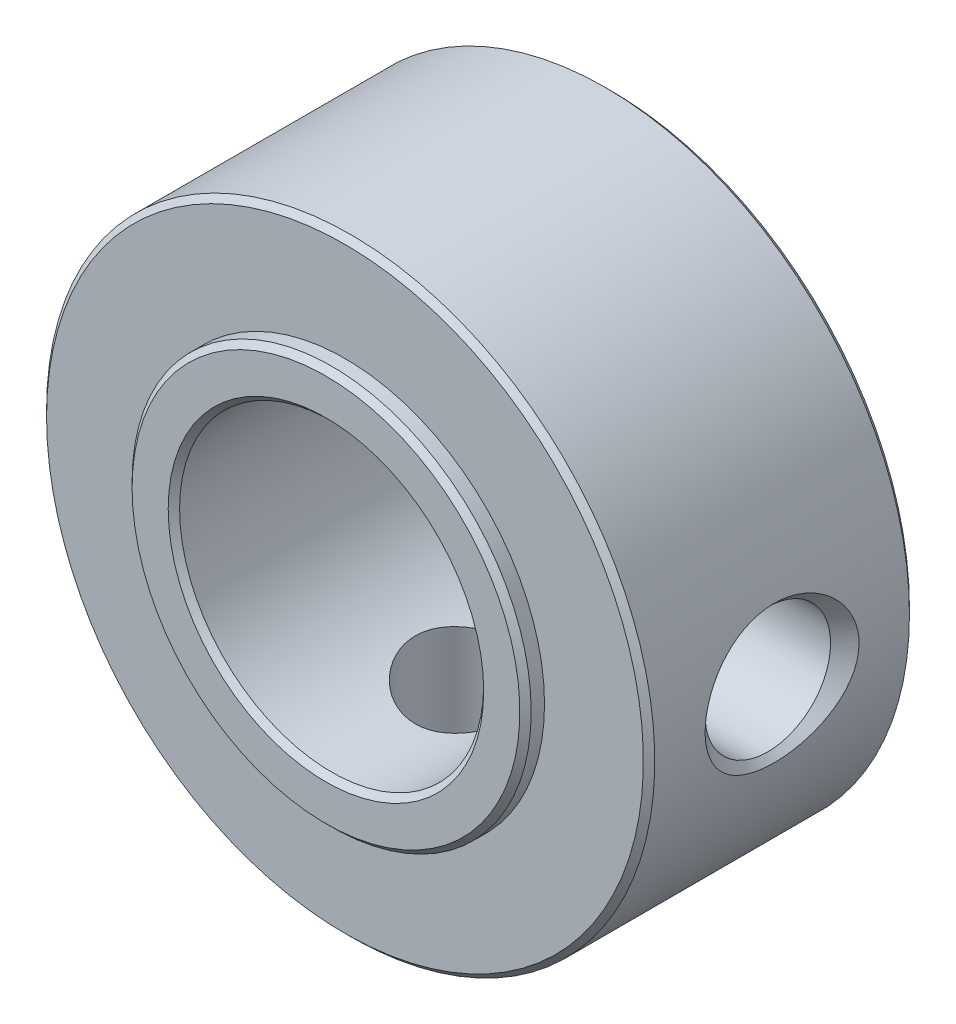
ISO-10303-21;
HEADER;
FILE_DESCRIPTION(('STEP AP214'),'2;1');
FILE_NAME('part.step','',(''),(''),'','','');
FILE_SCHEMA(('AUTOMOTIVE_DESIGN { 1 0 10303 214 1 1 1 1 }'));
ENDSEC;
DATA;
#1=APPLICATION_CONTEXT('core data for automotive mechanical design processes');
#2=APPLICATION_PROTOCOL_DEFINITION('international standard','automotive_design',2000,#1);
#3=PRODUCT_CONTEXT('',#1,'mechanical');
#4=PRODUCT('Part','Part','',(#3));
#5=PRODUCT_RELATED_PRODUCT_CATEGORY('part','',(#4));
#6=PRODUCT_DEFINITION_FORMATION('','',#4);
#7=PRODUCT_DEFINITION_CONTEXT('part definition',#1,'design');
#8=PRODUCT_DEFINITION('design','',#6,#7);
#9=PRODUCT_DEFINITION_SHAPE('','',#8);
#10=(LENGTH_UNIT() NAMED_UNIT(*) SI_UNIT(.MILLI.,.METRE.));
#11=(NAMED_UNIT(*) PLANE_ANGLE_UNIT() SI_UNIT($,.RADIAN.));
#12=(NAMED_UNIT(*) SI_UNIT($,.STERADIAN.) SOLID_ANGLE_UNIT());
#13=UNCERTAINTY_MEASURE_WITH_UNIT(LENGTH_MEASURE(1.E-05),#10,'distance_accuracy_value','');
#14=(GEOMETRIC_REPRESENTATION_CONTEXT(3) GLOBAL_UNCERTAINTY_ASSIGNED_CONTEXT((#13)) GLOBAL_UNIT_ASSIGNED_CONTEXT((#10,
#11,#12)) REPRESENTATION_CONTEXT('',''));
#15=CARTESIAN_POINT('',(0.,0.,0.));
#16=DIRECTION('',(0.,0.,1.));
#17=DIRECTION('',(1.,0.,0.));
#18=AXIS2_PLACEMENT_3D('',#15,#16,#17);
#19=CARTESIAN_POINT('',(0.,0.,7.5));
#20=DIRECTION('',(0.,0.,1.));
#21=DIRECTION('',(1.,0.,0.));
#22=AXIS2_PLACEMENT_3D('',#19,#20,#21);
#23=PLANE('',#22);
#24=CARTESIAN_POINT('',(0.,0.,7.50000000005002));
#25=DIRECTION('',(0.,0.,-1.));
#26=DIRECTION('',(-1.,0.,0.));
#27=AXIS2_PLACEMENT_3D('',#24,#25,#26);
#28=CIRCLE('',#27,5.09999999997035);
#29=CARTESIAN_POINT('',(-5.09999999997035,0.,7.50000000005002));
#30=VERTEX_POINT('',#29);
#31=EDGE_CURVE('E18',#30,#30,#28,.T.);
#32=ORIENTED_EDGE('',*,*,#31,.F.);
#33=EDGE_LOOP('',(#32));
#34=FACE_BOUND('',#33,.T.);
#35=CARTESIAN_POINT('',(0.,0.,7.49999999999318));
#36=DIRECTION('',(0.,0.,1.));
#37=DIRECTION('',(1.,0.,0.));
#38=AXIS2_PLACEMENT_3D('',#35,#36,#37);
#39=CIRCLE('',#38,4.15000000003829);
#40=CARTESIAN_POINT('',(4.15000000003829,0.,7.49999999999318));
#41=VERTEX_POINT('',#40);
#42=EDGE_CURVE('E51',#41,#41,#39,.F.);
#43=ORIENTED_EDGE('',*,*,#42,.T.);
#44=EDGE_LOOP('',(#43));
#45=FACE_BOUND('',#44,.T.);
#46=ADVANCED_FACE('F15',(#34,#45),#23,.T.);
#47=CARTESIAN_POINT('',(0.,0.,7.35000000003083));
#48=DIRECTION('',(0.,0.,-1.));
#49=DIRECTION('',(-1.,0.,0.));
#50=AXIS2_PLACEMENT_3D('',#47,#48,#49);
#51=CONICAL_SURFACE('',#50,5.24999999998954,0.785398163397448);
#52=ORIENTED_EDGE('',*,*,#31,.T.);
#53=EDGE_LOOP('',(#52));
#54=FACE_BOUND('',#53,.T.);
#55=CARTESIAN_POINT('',(0.,0.,7.35));
#56=DIRECTION('',(0.,0.,1.));
#57=DIRECTION('',(1.,0.,0.));
#58=AXIS2_PLACEMENT_3D('',#55,#56,#57);
#59=CIRCLE('',#58,5.25);
#60=CARTESIAN_POINT('',(5.25,0.,7.35));
#61=VERTEX_POINT('',#60);
#62=EDGE_CURVE('E49',#61,#61,#59,.F.);
#63=ORIENTED_EDGE('',*,*,#62,.F.);
#64=EDGE_LOOP('',(#63));
#65=FACE_BOUND('',#64,.T.);
#66=ADVANCED_FACE('F131',(#54,#65),#51,.T.);
#67=CARTESIAN_POINT('',(0.,0.,7.49999999999318));
#68=DIRECTION('',(0.,0.,1.));
#69=DIRECTION('',(1.,0.,0.));
#70=AXIS2_PLACEMENT_3D('',#67,#68,#69);
#71=CONICAL_SURFACE('',#70,4.15000000003829,0.785398163586926);
#72=CARTESIAN_POINT('',(0.,0.,7.34999999999999));
#73=DIRECTION('',(0.,0.,-1.));
#74=DIRECTION('',(-1.,0.,0.));
#75=AXIS2_PLACEMENT_3D('',#72,#73,#74);
#76=CIRCLE('',#75,4.);
#77=CARTESIAN_POINT('',(-4.,0.,7.34999999999999));
#78=VERTEX_POINT('',#77);
#79=EDGE_CURVE('E46',#78,#78,#76,.T.);
#80=ORIENTED_EDGE('',*,*,#79,.T.);
#81=EDGE_LOOP('',(#80));
#82=FACE_BOUND('',#81,.T.);
#83=ORIENTED_EDGE('',*,*,#42,.F.);
#84=EDGE_LOOP('',(#83));
#85=FACE_BOUND('',#84,.T.);
#86=ADVANCED_FACE('F138',(#82,#85),#71,.F.);
#87=CARTESIAN_POINT('',(0.,0.,7.));
#88=DIRECTION('',(0.,0.,1.));
#89=DIRECTION('',(1.,0.,0.));
#90=AXIS2_PLACEMENT_3D('',#87,#88,#89);
#91=CYLINDRICAL_SURFACE('',#90,5.25);
#92=CARTESIAN_POINT('',(0.,0.,7.));
#93=DIRECTION('',(0.,0.,1.));
#94=DIRECTION('',(1.,0.,0.));
#95=AXIS2_PLACEMENT_3D('',#92,#93,#94);
#96=CIRCLE('',#95,5.25);
#97=CARTESIAN_POINT('',(5.25,0.,7.));
#98=VERTEX_POINT('',#97);
#99=EDGE_CURVE('E99',#98,#98,#96,.F.);
#100=ORIENTED_EDGE('',*,*,#99,.F.);
#101=EDGE_LOOP('',(#100));
#102=FACE_BOUND('',#101,.T.);
#103=ORIENTED_EDGE('',*,*,#62,.T.);
#104=EDGE_LOOP('',(#103));
#105=FACE_BOUND('',#104,.T.);
#106=ADVANCED_FACE('F142',(#102,#105),#91,.T.);
#107=CARTESIAN_POINT('',(0.,0.,7.5));
#108=DIRECTION('',(0.,0.,-1.));
#109=DIRECTION('',(-1.,0.,0.));
#110=AXIS2_PLACEMENT_3D('',#107,#108,#109);
#111=CYLINDRICAL_SURFACE('',#110,4.);
#112=CARTESIAN_POINT('',(0.,0.,0.15000000001919));
#113=DIRECTION('',(0.,0.,-1.));
#114=DIRECTION('',(-1.,0.,0.));
#115=AXIS2_PLACEMENT_3D('',#112,#113,#114);
#116=CIRCLE('',#115,4.0000000000191);
#117=CARTESIAN_POINT('',(-4.0000000000191,0.,0.15000000001919));
#118=VERTEX_POINT('',#117);
#119=EDGE_CURVE('E42',#118,#118,#116,.T.);
#120=ORIENTED_EDGE('',*,*,#119,.T.);
#121=EDGE_LOOP('',(#120));
#122=FACE_BOUND('',#121,.T.);
#123=ORIENTED_EDGE('',*,*,#79,.F.);
#124=EDGE_LOOP('',(#123));
#125=FACE_BOUND('',#124,.T.);
#126=CARTESIAN_POINT('',(4.,0.,1.85));
#127=CARTESIAN_POINT('',(3.99999585726482,0.0885549160619695,1.85000514489207));
#128=CARTESIAN_POINT('',(3.997028409032,0.177184180058171,1.85716398813091));
#129=CARTESIAN_POINT('',(3.98545964481758,0.351856975930825,1.88551878631088));
#130=CARTESIAN_POINT('',(3.976850514947,0.437896748164862,1.9067342104666));
#131=CARTESIAN_POINT('',(3.95492160665832,0.604691884534116,1.96229006152674));
#132=CARTESIAN_POINT('',(3.94161545683044,0.685461744573868,1.99659253885022));
#133=CARTESIAN_POINT('',(3.91158817422191,0.840052178509409,2.07717998014856));
#134=CARTESIAN_POINT('',(3.89486701991101,0.913872708588157,2.12346501966917));
#135=CARTESIAN_POINT('',(3.85876833204881,1.05619061034005,2.22910873330968));
#136=CARTESIAN_POINT('',(3.83930510975193,1.12429882839234,2.28896208675762));
#137=CARTESIAN_POINT('',(3.80029338809321,1.2498399205569,2.41899402076001));
#138=CARTESIAN_POINT('',(3.78074485486912,1.30726806724748,2.48917714917466));
#139=CARTESIAN_POINT('',(3.74272564346987,1.41254793697253,2.64196774266061));
#140=CARTESIAN_POINT('',(3.72435183251521,1.45980721577971,2.72501004778027));
#141=CARTESIAN_POINT('',(3.69212153869983,1.53951316124616,2.89873514774658));
#142=CARTESIAN_POINT('',(3.67826283303889,1.57196711976939,2.98941415526536));
#143=CARTESIAN_POINT('',(3.6575602222167,1.61953737535208,3.17134796526373));
#144=CARTESIAN_POINT('',(3.6504144961432,1.63540370339227,3.26237100583385));
#145=CARTESIAN_POINT('',(3.64307714820835,1.65168918009178,3.44604643959926));
#146=CARTESIAN_POINT('',(3.64288180455983,1.65211659597365,3.53869793419594));
#147=CARTESIAN_POINT('',(3.64921138433624,1.63807781229056,3.71559884656184));
#148=CARTESIAN_POINT('',(3.65523439172559,1.62472400182667,3.79995807895503));
#149=CARTESIAN_POINT('',(3.67247531176467,1.5853648626047,3.96511020790623));
#150=CARTESIAN_POINT('',(3.68369420113931,1.55935715511321,4.04590243080667));
#151=CARTESIAN_POINT('',(3.71031484032437,1.49492352830995,4.20364661985598));
#152=CARTESIAN_POINT('',(3.72579982089932,1.45624726380927,4.28048165123455));
#153=CARTESIAN_POINT('',(3.7591868433067,1.36775249439787,4.4268628862473));
#154=CARTESIAN_POINT('',(3.7770897350672,1.31793006740109,4.49640651151658));
#155=CARTESIAN_POINT('',(3.81509472547591,1.20372749032202,4.63227673252978));
#156=CARTESIAN_POINT('',(3.83525637295225,1.13848514538875,4.69786392723013));
#157=CARTESIAN_POINT('',(3.87426393426769,0.997702260608786,4.81742996551744));
#158=CARTESIAN_POINT('',(3.89310918813188,0.922156610437793,4.87140301415707));
#159=CARTESIAN_POINT('',(3.92789225381276,0.760680202982012,4.96727004240079));
#160=CARTESIAN_POINT('',(3.94375388991043,0.674551772022748,5.00886021632027));
#161=CARTESIAN_POINT('',(3.97017876443006,0.495777298835732,5.07664298312844));
#162=CARTESIAN_POINT('',(3.98075257549392,0.403144687856789,5.10286631914301));
#163=CARTESIAN_POINT('',(3.99199778192374,0.258009867007399,5.13052567853921));
#164=CARTESIAN_POINT('',(3.99498716344097,0.206734726241449,5.13781617047826));
#165=CARTESIAN_POINT('',(3.9989894710513,0.103648210396509,5.14755480289322));
#166=CARTESIAN_POINT('',(4.00000242500724,0.0518368428873718,5.15000301163361));
#167=CARTESIAN_POINT('',(3.99999585726482,-0.0885549160619688,5.14999485510793));
#168=CARTESIAN_POINT('',(3.997028409032,-0.17718418005817,5.14283601186909));
#169=CARTESIAN_POINT('',(3.98545964481758,-0.351856975930825,5.11448121368912));
#170=CARTESIAN_POINT('',(3.976850514947,-0.437896748164862,5.0932657895334));
#171=CARTESIAN_POINT('',(3.95492160665832,-0.604691884534115,5.03770993847326));
#172=CARTESIAN_POINT('',(3.94161545683044,-0.685461744573867,5.00340746114978));
#173=CARTESIAN_POINT('',(3.91158817422191,-0.840052178509408,4.92282001985145));
#174=CARTESIAN_POINT('',(3.89486701991101,-0.913872708588157,4.87653498033083));
#175=CARTESIAN_POINT('',(3.85876833204881,-1.05619061034005,4.77089126669032));
#176=CARTESIAN_POINT('',(3.83930510975194,-1.12429882839234,4.71103791324238));
#177=CARTESIAN_POINT('',(3.80029338809321,-1.2498399205569,4.58100597923999));
#178=CARTESIAN_POINT('',(3.78074485486912,-1.30726806724748,4.51082285082534));
#179=CARTESIAN_POINT('',(3.74272564346987,-1.41254793697253,4.35803225733939));
#180=CARTESIAN_POINT('',(3.72435183251521,-1.45980721577971,4.27498995221973));
#181=CARTESIAN_POINT('',(3.69212153869983,-1.53951316124616,4.10126485225342));
#182=CARTESIAN_POINT('',(3.67826283303889,-1.57196711976939,4.01058584473464));
#183=CARTESIAN_POINT('',(3.6575602222167,-1.61953737535208,3.82865203473627));
#184=CARTESIAN_POINT('',(3.6504144961432,-1.63540370339227,3.73762899416615));
#185=CARTESIAN_POINT('',(3.64307714820835,-1.65168918009178,3.55395356040074));
#186=CARTESIAN_POINT('',(3.64288180455982,-1.65211659597365,3.46130206580406));
#187=CARTESIAN_POINT('',(3.64921138433624,-1.63807781229056,3.28440115343817));
#188=CARTESIAN_POINT('',(3.65523439172559,-1.62472400182667,3.20004192104497));
#189=CARTESIAN_POINT('',(3.67247531176467,-1.5853648626047,3.03488979209378));
#190=CARTESIAN_POINT('',(3.68369420113931,-1.55935715511321,2.95409756919333));
#191=CARTESIAN_POINT('',(3.71031484032437,-1.49492352830995,2.79635338014402));
#192=CARTESIAN_POINT('',(3.72579982089932,-1.45624726380927,2.71951834876545));
#193=CARTESIAN_POINT('',(3.7591868433067,-1.36775249439787,2.57313711375269));
#194=CARTESIAN_POINT('',(3.77708973506719,-1.31793006740109,2.50359348848342));
#195=CARTESIAN_POINT('',(3.81509472547591,-1.20372749032202,2.36772326747022));
#196=CARTESIAN_POINT('',(3.83525637295225,-1.13848514538875,2.30213607276987));
#197=CARTESIAN_POINT('',(3.87426393426769,-0.997702260608787,2.18257003448256));
#198=CARTESIAN_POINT('',(3.89310918813188,-0.922156610437793,2.12859698584293));
#199=CARTESIAN_POINT('',(3.92789225381276,-0.760680202982012,2.03272995759921));
#200=CARTESIAN_POINT('',(3.94375388991043,-0.674551772022749,1.99113978367974));
#201=CARTESIAN_POINT('',(3.97017876443006,-0.495777298835733,1.92335701687156));
#202=CARTESIAN_POINT('',(3.98075257549392,-0.40314468785679,1.89713368085699));
#203=CARTESIAN_POINT('',(3.99199778192373,-0.2580098670074,1.86947432146079));
#204=CARTESIAN_POINT('',(3.99498716344097,-0.206734726241449,1.86218382952174));
#205=CARTESIAN_POINT('',(3.9989894710513,-0.103648210396509,1.85244519710678));
#206=CARTESIAN_POINT('',(4.00000242500724,-0.0518368428873714,1.84999698836639));
#207=CARTESIAN_POINT('',(4.,0.,1.85));
#208=B_SPLINE_CURVE_WITH_KNOTS('',3,(#126,#127,#128,#129,#130,#131,#132,#133,#134,#135,#136,
#137,#138,#139,#140,#141,#142,#143,#144,#145,#146,#147,#148,#149,#150,#151,#152,#153,#154,#155,
#156,#157,#158,#159,#160,#161,#162,#163,#164,#165,#166,#167,#168,#169,#170,#171,#172,#173,#174,
#175,#176,#177,#178,#179,#180,#181,#182,#183,#184,#185,#186,#187,#188,#189,#190,#191,#192,#193,
#194,#195,#196,#197,#198,#199,#200,#201,#202,#203,#204,#205,#206,#207),.UNSPECIFIED.,.T.,.F.,(4,
2,2,2,2,2,2,2,2,2,2,2,2,2,2,2,2,2,2,2,2,2,2,2,2,2,2,2,2,2,2,2,2,2,2,2,2,2,2,2,4),(0.,
0.265463234820538,0.531294923054419,0.796361545720166,1.06142983957684,1.33842897342978,
1.61555042772574,1.90598218529158,2.19627074559331,2.47277637636454,2.74913394181434,
3.00480620700038,3.260526553127,3.52164033545582,3.78284614282264,4.06561324646369,
4.34852111295727,4.63788600175649,4.92666998878056,5.08206474951757,5.23745731954876,
5.50292055436929,5.76875224260318,6.03381886526892,6.2988871591256,6.57588629297854,
6.8530077472745,7.14343950484033,7.43372806514207,7.71023369591329,7.9865912613631,
8.24226352654914,8.49798387267575,8.75909765500458,9.0203034623714,9.30307056601245,
9.58597843250603,9.87534332130525,10.1641273083293,10.3195220690663,10.4749146390975),.UNSPECIFIED.);
#209=CARTESIAN_POINT('',(4.,0.,1.85));
#210=VERTEX_POINT('',#209);
#211=EDGE_CURVE('E91',#210,#210,#208,.T.);
#212=ORIENTED_EDGE('',*,*,#211,.T.);
#213=EDGE_LOOP('',(#212));
#214=FACE_BOUND('',#213,.T.);
#215=CARTESIAN_POINT('',(0.,-4.,1.85));
#216=CARTESIAN_POINT('',(0.0885549160619412,-3.99999585726482,1.85000514489207));
#217=CARTESIAN_POINT('',(0.177184180058142,-3.997028409032,1.85716398813091));
#218=CARTESIAN_POINT('',(0.351856975930797,-3.98545964481758,1.88551878631088));
#219=CARTESIAN_POINT('',(0.437896748164834,-3.976850514947,1.9067342104666));
#220=CARTESIAN_POINT('',(0.604691884534087,-3.95492160665833,1.96229006152674));
#221=CARTESIAN_POINT('',(0.685461744573839,-3.94161545683045,1.99659253885022));
#222=CARTESIAN_POINT('',(0.84005217850938,-3.91158817422192,2.07717998014855));
#223=CARTESIAN_POINT('',(0.913872708588128,-3.89486701991102,2.12346501966917));
#224=CARTESIAN_POINT('',(1.05619061034002,-3.85876833204882,2.22910873330968));
#225=CARTESIAN_POINT('',(1.12429882839231,-3.83930510975194,2.28896208675762));
#226=CARTESIAN_POINT('',(1.24983992055687,-3.80029338809322,2.41899402076001));
#227=CARTESIAN_POINT('',(1.30726806724745,-3.78074485486913,2.48917714917466));
#228=CARTESIAN_POINT('',(1.4125479369725,-3.74272564346988,2.6419677426606));
#229=CARTESIAN_POINT('',(1.45980721577968,-3.72435183251522,2.72501004778027));
#230=CARTESIAN_POINT('',(1.53951316124613,-3.69212153869984,2.89873514774658));
#231=CARTESIAN_POINT('',(1.57196711976936,-3.6782628330389,2.98941415526536));
#232=CARTESIAN_POINT('',(1.61953737535206,-3.65756022221671,3.17134796526373));
#233=CARTESIAN_POINT('',(1.63540370339225,-3.65041449614321,3.26237100583385));
#234=CARTESIAN_POINT('',(1.65168918009176,-3.64307714820836,3.44604643959926));
#235=CARTESIAN_POINT('',(1.65211659597362,-3.64288180455984,3.53869793419593));
#236=CARTESIAN_POINT('',(1.63807781229053,-3.64921138433625,3.71559884656183));
#237=CARTESIAN_POINT('',(1.62472400182665,-3.65523439172561,3.79995807895502));
#238=CARTESIAN_POINT('',(1.58536486260467,-3.67247531176468,3.96511020790622));
#239=CARTESIAN_POINT('',(1.55935715511318,-3.68369420113932,4.04590243080667));
#240=CARTESIAN_POINT('',(1.49492352830992,-3.71031484032438,4.20364661985598));
#241=CARTESIAN_POINT('',(1.45624726380924,-3.72579982089933,4.28048165123455));
#242=CARTESIAN_POINT('',(1.36775249439784,-3.75918684330671,4.4268628862473));
#243=CARTESIAN_POINT('',(1.31793006740106,-3.77708973506721,4.49640651151658));
#244=CARTESIAN_POINT('',(1.20372749032199,-3.81509472547592,4.63227673252978));
#245=CARTESIAN_POINT('',(1.13848514538872,-3.83525637295226,4.69786392723013));
#246=CARTESIAN_POINT('',(0.997702260608757,-3.8742639342677,4.81742996551744));
#247=CARTESIAN_POINT('',(0.922156610437763,-3.89310918813189,4.87140301415707));
#248=CARTESIAN_POINT('',(0.760680202981982,-3.92789225381276,4.96727004240079));
#249=CARTESIAN_POINT('',(0.674551772022719,-3.94375388991043,5.00886021632027));
#250=CARTESIAN_POINT('',(0.495777298835704,-3.97017876443006,5.07664298312844));
#251=CARTESIAN_POINT('',(0.403144687856762,-3.98075257549392,5.10286631914301));
#252=CARTESIAN_POINT('',(0.258009867007372,-3.99199778192374,5.13052567853921));
#253=CARTESIAN_POINT('',(0.206734726241422,-3.99498716344097,5.13781617047826));
#254=CARTESIAN_POINT('',(0.103648210396482,-3.9989894710513,5.14755480289322));
#255=CARTESIAN_POINT('',(0.0518368428873441,-4.00000242500724,5.15000301163361));
#256=CARTESIAN_POINT('',(-0.0885549160619969,-3.99999585726482,5.14999485510793));
#257=CARTESIAN_POINT('',(-0.177184180058198,-3.997028409032,5.14283601186909));
#258=CARTESIAN_POINT('',(-0.351856975930853,-3.98545964481758,5.11448121368912));
#259=CARTESIAN_POINT('',(-0.437896748164891,-3.976850514947,5.0932657895334));
#260=CARTESIAN_POINT('',(-0.604691884534144,-3.95492160665832,5.03770993847326));
#261=CARTESIAN_POINT('',(-0.685461744573897,-3.94161545683044,5.00340746114978));
#262=CARTESIAN_POINT('',(-0.840052178509438,-3.9115881742219,4.92282001985144));
#263=CARTESIAN_POINT('',(-0.913872708588186,-3.89486701991101,4.87653498033083));
#264=CARTESIAN_POINT('',(-1.05619061034008,-3.8587683320488,4.77089126669032));
#265=CARTESIAN_POINT('',(-1.12429882839237,-3.83930510975193,4.71103791324238));
#266=CARTESIAN_POINT('',(-1.24983992055693,-3.8002933880932,4.58100597923999));
#267=CARTESIAN_POINT('',(-1.30726806724751,-3.78074485486911,4.51082285082534));
#268=CARTESIAN_POINT('',(-1.41254793697256,-3.74272564346986,4.35803225733939));
#269=CARTESIAN_POINT('',(-1.45980721577974,-3.7243518325152,4.27498995221973));
#270=CARTESIAN_POINT('',(-1.53951316124618,-3.69212153869981,4.10126485225342));
#271=CARTESIAN_POINT('',(-1.57196711976942,-3.67826283303888,4.01058584473464));
#272=CARTESIAN_POINT('',(-1.61953737535211,-3.65756022221669,3.82865203473627));
#273=CARTESIAN_POINT('',(-1.6354037033923,-3.65041449614319,3.73762899416615));
#274=CARTESIAN_POINT('',(-1.65168918009181,-3.64307714820834,3.55395356040074));
#275=CARTESIAN_POINT('',(-1.65211659597368,-3.64288180455981,3.46130206580406));
#276=CARTESIAN_POINT('',(-1.63807781229058,-3.64921138433623,3.28440115343816));
#277=CARTESIAN_POINT('',(-1.6247240018267,-3.65523439172558,3.20004192104497));
#278=CARTESIAN_POINT('',(-1.58536486260472,-3.67247531176466,3.03488979209377));
#279=CARTESIAN_POINT('',(-1.55935715511323,-3.6836942011393,2.95409756919333));
#280=CARTESIAN_POINT('',(-1.49492352830997,-3.71031484032436,2.79635338014402));
#281=CARTESIAN_POINT('',(-1.4562472638093,-3.72579982089931,2.71951834876545));
#282=CARTESIAN_POINT('',(-1.3677524943979,-3.75918684330669,2.5731371137527));
#283=CARTESIAN_POINT('',(-1.31793006740112,-3.77708973506719,2.50359348848342));
#284=CARTESIAN_POINT('',(-1.20372749032205,-3.8150947254759,2.36772326747022));
#285=CARTESIAN_POINT('',(-1.13848514538878,-3.83525637295224,2.30213607276987));
#286=CARTESIAN_POINT('',(-0.997702260608816,-3.87426393426768,2.18257003448256));
#287=CARTESIAN_POINT('',(-0.922156610437822,-3.89310918813188,2.12859698584293));
#288=CARTESIAN_POINT('',(-0.76068020298204,-3.92789225381275,2.03272995759921));
#289=CARTESIAN_POINT('',(-0.674551772022777,-3.94375388991042,1.99113978367974));
#290=CARTESIAN_POINT('',(-0.495777298835761,-3.97017876443005,1.92335701687155));
#291=CARTESIAN_POINT('',(-0.403144687856818,-3.98075257549392,1.89713368085699));
#292=CARTESIAN_POINT('',(-0.258009867007428,-3.99199778192373,1.86947432146079));
#293=CARTESIAN_POINT('',(-0.206734726241477,-3.99498716344097,1.86218382952174));
#294=CARTESIAN_POINT('',(-0.103648210396538,-3.9989894710513,1.85244519710678));
#295=CARTESIAN_POINT('',(-0.0518368428873997,-4.00000242500724,1.84999698836639));
#296=CARTESIAN_POINT('',(0.,-4.,1.85));
#297=B_SPLINE_CURVE_WITH_KNOTS('',3,(#215,#216,#217,#218,#219,#220,#221,#222,#223,#224,#225,
#226,#227,#228,#229,#230,#231,#232,#233,#234,#235,#236,#237,#238,#239,#240,#241,#242,#243,#244,
#245,#246,#247,#248,#249,#250,#251,#252,#253,#254,#255,#256,#257,#258,#259,#260,#261,#262,#263,
#264,#265,#266,#267,#268,#269,#270,#271,#272,#273,#274,#275,#276,#277,#278,#279,#280,#281,#282,
#283,#284,#285,#286,#287,#288,#289,#290,#291,#292,#293,#294,#295,#296),.UNSPECIFIED.,.T.,.F.,(4,
2,2,2,2,2,2,2,2,2,2,2,2,2,2,2,2,2,2,2,2,2,2,2,2,2,2,2,2,2,2,2,2,2,2,2,2,2,2,2,4),(0.,
0.265463234820537,0.531294923054418,0.796361545720164,1.06142983957684,1.33842897342978,
1.61555042772574,1.90598218529157,2.19627074559331,2.47277637636453,2.74913394181434,
3.00480620700038,3.26052655312699,3.52164033545582,3.78284614282264,4.06561324646369,
4.34852111295727,4.63788600175649,4.92666998878056,5.08206474951756,5.23745731954875,
5.50292055436929,5.76875224260317,6.03381886526892,6.29888715912559,6.57588629297854,
6.8530077472745,7.14343950484033,7.43372806514207,7.7102336959133,7.9865912613631,
8.24226352654914,8.49798387267575,8.75909765500458,9.0203034623714,9.30307056601245,
9.58597843250603,9.87534332130525,10.1641273083293,10.3195220690663,10.4749146390975),.UNSPECIFIED.);
#298=CARTESIAN_POINT('',(0.,-4.,1.85));
#299=VERTEX_POINT('',#298);
#300=EDGE_CURVE('E45',#299,#299,#297,.T.);
#301=ORIENTED_EDGE('',*,*,#300,.T.);
#302=EDGE_LOOP('',(#301));
#303=FACE_BOUND('',#302,.T.);
#304=ADVANCED_FACE('F101',(#122,#125,#214,#303),#111,.F.);
#305=CARTESIAN_POINT('',(0.,0.,-5.6843418860808E-11));
#306=DIRECTION('',(0.,0.,-1.));
#307=DIRECTION('',(-1.,0.,0.));
#308=AXIS2_PLACEMENT_3D('',#305,#306,#307);
#309=CONICAL_SURFACE('',#308,4.15000000009513,0.785398163397448);
#310=CARTESIAN_POINT('',(0.,0.,0.));
#311=DIRECTION('',(0.,0.,-1.));
#312=DIRECTION('',(-1.,0.,0.));
#313=AXIS2_PLACEMENT_3D('',#310,#311,#312);
#314=CIRCLE('',#313,4.15000000003829);
#315=CARTESIAN_POINT('',(-4.15000000003829,0.,0.));
#316=VERTEX_POINT('',#315);
#317=EDGE_CURVE('E41',#316,#316,#314,.T.);
#318=ORIENTED_EDGE('',*,*,#317,.T.);
#319=EDGE_LOOP('',(#318));
#320=FACE_BOUND('',#319,.T.);
#321=ORIENTED_EDGE('',*,*,#119,.F.);
#322=EDGE_LOOP('',(#321));
#323=FACE_BOUND('',#322,.T.);
#324=ADVANCED_FACE('F119',(#320,#323),#309,.F.);
#325=CARTESIAN_POINT('',(0.,-8.,3.5));
#326=DIRECTION('',(0.,-1.,0.));
#327=DIRECTION('',(0.,0.,-1.));
#328=AXIS2_PLACEMENT_3D('',#325,#326,#327);
#329=CYLINDRICAL_SURFACE('',#328,1.65);
#330=ORIENTED_EDGE('',*,*,#300,.F.);
#331=EDGE_LOOP('',(#330));
#332=FACE_BOUND('',#331,.T.);
#333=CARTESIAN_POINT('',(0.,-7.62500000007549,3.5));
#334=DIRECTION('',(0.,-1.,0.));
#335=DIRECTION('',(0.,0.,-1.));
#336=AXIS2_PLACEMENT_3D('',#333,#334,#335);
#337=CIRCLE('',#336,1.65000000000964);
#338=CARTESIAN_POINT('',(0.,-7.62500000007549,1.84999999999036));
#339=VERTEX_POINT('',#338);
#340=EDGE_CURVE('E38',#339,#339,#337,.T.);
#341=ORIENTED_EDGE('',*,*,#340,.T.);
#342=EDGE_LOOP('',(#341));
#343=FACE_BOUND('',#342,.T.);
#344=ADVANCED_FACE('F115',(#332,#343),#329,.F.);
#345=CARTESIAN_POINT('',(0.,0.,7.));
#346=DIRECTION('',(0.,0.,1.));
#347=DIRECTION('',(1.,0.,0.));
#348=AXIS2_PLACEMENT_3D('',#345,#346,#347);
#349=PLANE('',#348);
#350=ORIENTED_EDGE('',*,*,#99,.T.);
#351=EDGE_LOOP('',(#350));
#352=FACE_BOUND('',#351,.T.);
#353=CARTESIAN_POINT('',(0.,0.,7.));
#354=DIRECTION('',(0.,0.,-1.));
#355=DIRECTION('',(-1.,0.,0.));
#356=AXIS2_PLACEMENT_3D('',#353,#354,#355);
#357=CIRCLE('',#356,7.85000000000001);
#358=CARTESIAN_POINT('',(-7.85000000000001,0.,7.));
#359=VERTEX_POINT('',#358);
#360=EDGE_CURVE('E37',#359,#359,#357,.T.);
#361=ORIENTED_EDGE('',*,*,#360,.F.);
#362=EDGE_LOOP('',(#361));
#363=FACE_BOUND('',#362,.T.);
#364=ADVANCED_FACE('F111',(#352,#363),#349,.T.);
#365=CARTESIAN_POINT('',(8.,0.,3.5));
#366=DIRECTION('',(1.,0.,0.));
#367=DIRECTION('',(0.,0.,-1.));
#368=AXIS2_PLACEMENT_3D('',#365,#366,#367);
#369=CYLINDRICAL_SURFACE('',#368,1.65);
#370=ORIENTED_EDGE('',*,*,#211,.F.);
#371=EDGE_LOOP('',(#370));
#372=FACE_BOUND('',#371,.T.);
#373=CARTESIAN_POINT('',(7.62500000007549,0.,3.5));
#374=DIRECTION('',(1.,0.,0.));
#375=DIRECTION('',(0.,0.,-1.));
#376=AXIS2_PLACEMENT_3D('',#373,#374,#375);
#377=CIRCLE('',#376,1.65000000000964);
#378=CARTESIAN_POINT('',(7.62500000007549,0.,1.84999999999036));
#379=VERTEX_POINT('',#378);
#380=EDGE_CURVE('E33',#379,#379,#377,.T.);
#381=ORIENTED_EDGE('',*,*,#380,.T.);
#382=EDGE_LOOP('',(#381));
#383=FACE_BOUND('',#382,.T.);
#384=ADVANCED_FACE('F105',(#372,#383),#369,.F.);
#385=CARTESIAN_POINT('',(0.,0.,0.));
#386=DIRECTION('',(0.,0.,1.));
#387=DIRECTION('',(1.,0.,0.));
#388=AXIS2_PLACEMENT_3D('',#385,#386,#387);
#389=PLANE('',#388);
#390=ORIENTED_EDGE('',*,*,#317,.F.);
#391=EDGE_LOOP('',(#390));
#392=FACE_BOUND('',#391,.T.);
#393=CARTESIAN_POINT('',(0.,0.,0.));
#394=DIRECTION('',(0.,0.,1.));
#395=DIRECTION('',(1.,0.,0.));
#396=AXIS2_PLACEMENT_3D('',#393,#394,#395);
#397=CIRCLE('',#396,7.85);
#398=CARTESIAN_POINT('',(7.85,0.,0.));
#399=VERTEX_POINT('',#398);
#400=EDGE_CURVE('E36',#399,#399,#397,.T.);
#401=ORIENTED_EDGE('',*,*,#400,.F.);
#402=EDGE_LOOP('',(#401));
#403=FACE_BOUND('',#402,.T.);
#404=ADVANCED_FACE('F110',(#392,#403),#389,.F.);
#405=CARTESIAN_POINT('',(0.,-8.0022500000041,3.5));
#406=DIRECTION('',(0.,-1.,0.));
#407=DIRECTION('',(0.,0.,-1.));
#408=AXIS2_PLACEMENT_3D('',#405,#406,#407);
#409=CONICAL_SURFACE('',#408,2.02724999999509,0.785398163472787);
#410=ORIENTED_EDGE('',*,*,#340,.F.);
#411=EDGE_LOOP('',(#410));
#412=FACE_BOUND('',#411,.T.);
#413=CARTESIAN_POINT('',(0.,-8.,5.52499999999066));
#414=CARTESIAN_POINT('',(0.101032107985774,-7.99999390827451,5.52498234140337));
#415=CARTESIAN_POINT('',(0.202222660789071,-7.99805819018011,5.51545172313732));
#416=CARTESIAN_POINT('',(0.401126326895786,-7.99056183641907,5.4778454033551));
#417=CARTESIAN_POINT('',(0.498829424534539,-7.9849915274545,5.44972021057316));
#418=CARTESIAN_POINT('',(0.677366227402963,-7.97172057501192,5.38047822815211));
#419=CARTESIAN_POINT('',(0.758889134744433,-7.96430932850547,5.34106024920551));
#420=CARTESIAN_POINT('',(0.914744230084696,-7.9479171454713,5.2503447668645));
#421=CARTESIAN_POINT('',(0.989080938631841,-7.93893720585856,5.19905480150853));
#422=CARTESIAN_POINT('',(1.13585388563042,-7.91933178317514,5.08108018504864));
#423=CARTESIAN_POINT('',(1.20749035692397,-7.90863091513577,5.01341497692973));
#424=CARTESIAN_POINT('',(1.3397493307921,-7.88730432126764,4.86804087542141));
#425=CARTESIAN_POINT('',(1.40036476363035,-7.87667864784463,4.79032558945127));
#426=CARTESIAN_POINT('',(1.51597846149492,-7.85529464152506,4.61765777466367));
#427=CARTESIAN_POINT('',(1.56957386712648,-7.84465630715053,4.52174969166314));
#428=CARTESIAN_POINT('',(1.66143187843348,-7.82571707305278,4.32264179767311));
#429=CARTESIAN_POINT('',(1.69968919856677,-7.81741697938555,4.2194394874611));
#430=CARTESIAN_POINT('',(1.76277196306148,-7.80344634499925,3.9998531593854));
#431=CARTESIAN_POINT('',(1.78628594321917,-7.79803768361475,3.88307376437846));
#432=CARTESIAN_POINT('',(1.81445498356357,-7.7915314186833,3.6471413147399));
#433=CARTESIAN_POINT('',(1.81910671360413,-7.79043457639268,3.52798784469463));
#434=CARTESIAN_POINT('',(1.80932959136409,-7.79271177641751,3.28704208555145));
#435=CARTESIAN_POINT('',(1.79434539072886,-7.79621595144214,3.16527306029559));
#436=CARTESIAN_POINT('',(1.74457247047122,-7.80750348908663,2.9260322039274));
#437=CARTESIAN_POINT('',(1.70978083144269,-7.81528748250048,2.80856100898653));
#438=CARTESIAN_POINT('',(1.62107079076024,-7.8341670612917,2.58165905082926));
#439=CARTESIAN_POINT('',(1.5671978001236,-7.8452547744056,2.47220993616357));
#440=CARTESIAN_POINT('',(1.44117587872901,-7.86937814570293,2.26457358458371));
#441=CARTESIAN_POINT('',(1.369028658872,-7.8824136214828,2.16638529463901));
#442=CARTESIAN_POINT('',(1.21120499319396,-7.90816607791913,1.98888760281656));
#443=CARTESIAN_POINT('',(1.12623136488891,-7.92087314913396,1.90895453716621));
#444=CARTESIAN_POINT('',(0.942513959150081,-7.94482232314139,1.76644566220486));
#445=CARTESIAN_POINT('',(0.843775087239784,-7.95606494507136,1.70386369312104));
#446=CARTESIAN_POINT('',(0.646322661147235,-7.97440034251807,1.60508583368945));
#447=CARTESIAN_POINT('',(0.548671008279993,-7.98180279883005,1.56682491371774));
#448=CARTESIAN_POINT('',(0.347907579334135,-7.99305705987468,1.50944673830778));
#449=CARTESIAN_POINT('',(0.244815949212924,-7.99692110964205,1.49026344272602));
#450=CARTESIAN_POINT('',(0.09409840522254,-7.99958690504132,1.4770480654633));
#451=CARTESIAN_POINT('',(0.0470663955887819,-8.00000283786578,1.47499177365367));
#452=CARTESIAN_POINT('',(-0.101032107985828,-7.99999390827451,1.47501765859663));
#453=CARTESIAN_POINT('',(-0.202222660789126,-7.99805819018011,1.48454827686269));
#454=CARTESIAN_POINT('',(-0.40112632689584,-7.99056183641907,1.52215459664491));
#455=CARTESIAN_POINT('',(-0.498829424534593,-7.9849915274545,1.55027978942684));
#456=CARTESIAN_POINT('',(-0.677366227403017,-7.97172057501191,1.6195217718479));
#457=CARTESIAN_POINT('',(-0.758889134744487,-7.96430932850547,1.65893975079449));
#458=CARTESIAN_POINT('',(-0.91474423008475,-7.94791714547129,1.74965523313551));
#459=CARTESIAN_POINT('',(-0.989080938631895,-7.93893720585856,1.80094519849148));
#460=CARTESIAN_POINT('',(-1.13585388563047,-7.91933178317514,1.91891981495137));
#461=CARTESIAN_POINT('',(-1.20749035692402,-7.90863091513576,1.98658502307028));
#462=CARTESIAN_POINT('',(-1.33974933079216,-7.88730432126763,2.1319591245786));
#463=CARTESIAN_POINT('',(-1.4003647636304,-7.87667864784462,2.20967441054874));
#464=CARTESIAN_POINT('',(-1.51597846149498,-7.85529464152505,2.38234222533634));
#465=CARTESIAN_POINT('',(-1.56957386712653,-7.84465630715052,2.47825030833687));
#466=CARTESIAN_POINT('',(-1.66143187843353,-7.82571707305277,2.6773582023269));
#467=CARTESIAN_POINT('',(-1.69968919856682,-7.81741697938554,2.78056051253892));
#468=CARTESIAN_POINT('',(-1.76277196306153,-7.80344634499924,3.00014684061461));
#469=CARTESIAN_POINT('',(-1.78628594321922,-7.79803768361474,3.11692623562155));
#470=CARTESIAN_POINT('',(-1.81445498356361,-7.79153141868329,3.35285868526011));
#471=CARTESIAN_POINT('',(-1.81910671360418,-7.79043457639267,3.47201215530538));
#472=CARTESIAN_POINT('',(-1.80932959136414,-7.7927117764175,3.71295791444856));
#473=CARTESIAN_POINT('',(-1.7943453907289,-7.79621595144213,3.83472693970442));
#474=CARTESIAN_POINT('',(-1.74457247047126,-7.80750348908662,4.07396779607261));
#475=CARTESIAN_POINT('',(-1.70978083144274,-7.81528748250047,4.19143899101348));
#476=CARTESIAN_POINT('',(-1.62107079076028,-7.8341670612917,4.41834094917075));
#477=CARTESIAN_POINT('',(-1.56719780012364,-7.84525477440559,4.52779006383644));
#478=CARTESIAN_POINT('',(-1.44117587872905,-7.86937814570293,4.7354264154163));
#479=CARTESIAN_POINT('',(-1.36902865887204,-7.88241362148279,4.83361470536099));
#480=CARTESIAN_POINT('',(-1.21120499319399,-7.90816607791913,5.01111239718345));
#481=CARTESIAN_POINT('',(-1.12623136488895,-7.92087314913395,5.0910454628338));
#482=CARTESIAN_POINT('',(-0.942513959150119,-7.94482232314139,5.23355433779515));
#483=CARTESIAN_POINT('',(-0.843775087239821,-7.95606494507135,5.29613630687897));
#484=CARTESIAN_POINT('',(-0.646322661147272,-7.97440034251806,5.39491416631055));
#485=CARTESIAN_POINT('',(-0.548671008280029,-7.98180279883004,5.43317508628226));
#486=CARTESIAN_POINT('',(-0.347907579334171,-7.99305705987467,5.49055326169222));
#487=CARTESIAN_POINT('',(-0.24481594921296,-7.99692110964205,5.50973655727399));
#488=CARTESIAN_POINT('',(-0.0940984052225822,-7.99958690504132,5.5229519345367));
#489=CARTESIAN_POINT('',(-0.0470663955888304,-8.00000283786578,5.52500822634633));
#490=CARTESIAN_POINT('',(0.,-8.,5.52499999999066));
#491=B_SPLINE_CURVE_WITH_KNOTS('',3,(#413,#414,#415,#416,#417,#418,#419,#420,#421,#422,#423,
#424,#425,#426,#427,#428,#429,#430,#431,#432,#433,#434,#435,#436,#437,#438,#439,#440,#441,#442,
#443,#444,#445,#446,#447,#448,#449,#450,#451,#452,#453,#454,#455,#456,#457,#458,#459,#460,#461,
#462,#463,#464,#465,#466,#467,#468,#469,#470,#471,#472,#473,#474,#475,#476,#477,#478,#479,#480,
#481,#482,#483,#484,#485,#486,#487,#488,#489,#490),.UNSPECIFIED.,.T.,.F.,(4,2,2,2,2,2,2,2,2,2,2,
2,2,2,2,2,2,2,2,2,2,2,2,2,2,2,2,2,2,2,2,2,2,2,2,2,2,2,4),(0.,0.302922678392425,
0.606654878347283,0.878100377676083,1.14937399500154,1.44553047213073,1.74187626150824,
2.07161884397962,2.40147495909178,2.75758563378782,3.11375917738651,3.48022676876522,
3.8467483875647,4.21240353182532,4.57802445474441,4.92815282227244,5.27815673191276,
5.59181872778612,5.90439111486244,6.04550940783168,6.3484320862241,6.65216428617896,
6.92360978550776,7.19488340283322,7.49103987996241,7.78738566933992,8.1171282518113,
8.44698436692346,8.8030950416195,9.15926858521819,9.5257361765969,9.89225779539639,
10.257912939657,10.6235338625761,10.9736622301041,11.3236661397444,11.6373281356178,
11.9499005226941,12.0910188156633),.UNSPECIFIED.);
#492=CARTESIAN_POINT('',(0.,-8.,5.52499999999066));
#493=VERTEX_POINT('',#492);
#494=EDGE_CURVE('E32',#493,#493,#491,.T.);
#495=ORIENTED_EDGE('',*,*,#494,.F.);
#496=EDGE_LOOP('',(#495));
#497=FACE_BOUND('',#496,.T.);
#498=ADVANCED_FACE('F159',(#412,#497),#409,.F.);
#499=CARTESIAN_POINT('',(0.,0.,6.85));
#500=DIRECTION('',(0.,0.,-1.));
#501=DIRECTION('',(-1.,0.,0.));
#502=AXIS2_PLACEMENT_3D('',#499,#500,#501);
#503=CONICAL_SURFACE('',#502,8.,0.785398163397448);
#504=CARTESIAN_POINT('',(0.,0.,6.85));
#505=DIRECTION('',(0.,0.,-1.));
#506=DIRECTION('',(-1.,0.,0.));
#507=AXIS2_PLACEMENT_3D('',#504,#505,#506);
#508=CIRCLE('',#507,8.);
#509=CARTESIAN_POINT('',(-8.,0.,6.85));
#510=VERTEX_POINT('',#509);
#511=EDGE_CURVE('E27',#510,#510,#508,.T.);
#512=ORIENTED_EDGE('',*,*,#511,.F.);
#513=EDGE_LOOP('',(#512));
#514=FACE_BOUND('',#513,.T.);
#515=ORIENTED_EDGE('',*,*,#360,.T.);
#516=EDGE_LOOP('',(#515));
#517=FACE_BOUND('',#516,.T.);
#518=ADVANCED_FACE('F79',(#514,#517),#503,.T.);
#519=CARTESIAN_POINT('',(8.0022500000041,0.,3.5));
#520=DIRECTION('',(1.,0.,0.));
#521=DIRECTION('',(0.,0.,-1.));
#522=AXIS2_PLACEMENT_3D('',#519,#520,#521);
#523=CONICAL_SURFACE('',#522,2.02724999999509,0.785398163472787);
#524=ORIENTED_EDGE('',*,*,#380,.F.);
#525=EDGE_LOOP('',(#524));
#526=FACE_BOUND('',#525,.T.);
#527=CARTESIAN_POINT('',(8.,0.,5.52499999999066));
#528=CARTESIAN_POINT('',(7.99999390827451,0.101032107985801,5.52498234140337));
#529=CARTESIAN_POINT('',(7.99805819018011,0.202222660789099,5.51545172313731));
#530=CARTESIAN_POINT('',(7.99056183641907,0.401126326895814,5.4778454033551));
#531=CARTESIAN_POINT('',(7.9849915274545,0.498829424534567,5.44972021057316));
#532=CARTESIAN_POINT('',(7.97172057501191,0.677366227402991,5.3804782281521));
#533=CARTESIAN_POINT('',(7.96430932850547,0.758889134744462,5.34106024920551));
#534=CARTESIAN_POINT('',(7.9479171454713,0.914744230084725,5.25034476686449));
#535=CARTESIAN_POINT('',(7.93893720585856,0.989080938631869,5.19905480150852));
#536=CARTESIAN_POINT('',(7.91933178317514,1.13585388563045,5.08108018504864));
#537=CARTESIAN_POINT('',(7.90863091513576,1.20749035692399,5.01341497692972));
#538=CARTESIAN_POINT('',(7.88730432126764,1.33974933079213,4.86804087542141));
#539=CARTESIAN_POINT('',(7.87667864784462,1.40036476363038,4.79032558945127));
#540=CARTESIAN_POINT('',(7.85529464152505,1.51597846149495,4.61765777466366));
#541=CARTESIAN_POINT('',(7.84465630715052,1.56957386712651,4.52174969166314));
#542=CARTESIAN_POINT('',(7.82571707305278,1.66143187843351,4.3226417976731));
#543=CARTESIAN_POINT('',(7.81741697938554,1.6996891985668,4.21943948746109));
#544=CARTESIAN_POINT('',(7.80344634499925,1.76277196306151,3.99985315938539));
#545=CARTESIAN_POINT('',(7.79803768361475,1.7862859432192,3.88307376437845));
#546=CARTESIAN_POINT('',(7.7915314186833,1.81445498356359,3.64714131473989));
#547=CARTESIAN_POINT('',(7.79043457639268,1.81910671360416,3.52798784469462));
#548=CARTESIAN_POINT('',(7.79271177641751,1.80932959136411,3.28704208555145));
#549=CARTESIAN_POINT('',(7.79621595144214,1.79434539072888,3.16527306029558));
#550=CARTESIAN_POINT('',(7.80750348908662,1.74457247047124,2.9260322039274));
#551=CARTESIAN_POINT('',(7.81528748250048,1.70978083144271,2.80856100898653));
#552=CARTESIAN_POINT('',(7.8341670612917,1.62107079076026,2.58165905082926));
#553=CARTESIAN_POINT('',(7.84525477440559,1.56719780012362,2.47220993616357));
#554=CARTESIAN_POINT('',(7.86937814570293,1.44117587872903,2.2645735845837));
#555=CARTESIAN_POINT('',(7.8824136214828,1.36902865887202,2.16638529463901));
#556=CARTESIAN_POINT('',(7.90816607791913,1.21120499319397,1.98888760281656));
#557=CARTESIAN_POINT('',(7.92087314913395,1.12623136488893,1.90895453716621));
#558=CARTESIAN_POINT('',(7.94482232314139,0.942513959150099,1.76644566220486));
#559=CARTESIAN_POINT('',(7.95606494507135,0.843775087239801,1.70386369312103));
#560=CARTESIAN_POINT('',(7.97440034251806,0.646322661147253,1.60508583368945));
#561=CARTESIAN_POINT('',(7.98180279883005,0.548671008280011,1.56682491371774));
#562=CARTESIAN_POINT('',(7.99305705987468,0.347907579334153,1.50944673830778));
#563=CARTESIAN_POINT('',(7.99692110964205,0.244815949212942,1.49026344272601));
#564=CARTESIAN_POINT('',(7.99958690504132,0.0940984052225609,1.4770480654633));
#565=CARTESIAN_POINT('',(8.00000283786578,0.0470663955888064,1.47499177365367));
#566=CARTESIAN_POINT('',(7.99999390827451,-0.1010321079858,1.47501765859663));
#567=CARTESIAN_POINT('',(7.99805819018011,-0.202222660789098,1.48454827686269));
#568=CARTESIAN_POINT('',(7.99056183641907,-0.401126326895812,1.5221545966449));
#569=CARTESIAN_POINT('',(7.9849915274545,-0.498829424534566,1.55027978942684));
#570=CARTESIAN_POINT('',(7.97172057501191,-0.67736622740299,1.6195217718479));
#571=CARTESIAN_POINT('',(7.96430932850547,-0.75888913474446,1.65893975079449));
#572=CARTESIAN_POINT('',(7.9479171454713,-0.914744230084723,1.74965523313551));
#573=CARTESIAN_POINT('',(7.93893720585856,-0.989080938631868,1.80094519849148));
#574=CARTESIAN_POINT('',(7.91933178317514,-1.13585388563044,1.91891981495136));
#575=CARTESIAN_POINT('',(7.90863091513576,-1.20749035692399,1.98658502307028));
#576=CARTESIAN_POINT('',(7.88730432126764,-1.33974933079213,2.13195912457859));
#577=CARTESIAN_POINT('',(7.87667864784462,-1.40036476363038,2.20967441054873));
#578=CARTESIAN_POINT('',(7.85529464152505,-1.51597846149495,2.38234222533634));
#579=CARTESIAN_POINT('',(7.84465630715052,-1.56957386712651,2.47825030833686));
#580=CARTESIAN_POINT('',(7.82571707305278,-1.6614318784335,2.6773582023269));
#581=CARTESIAN_POINT('',(7.81741697938554,-1.6996891985668,2.78056051253891));
#582=CARTESIAN_POINT('',(7.80344634499925,-1.76277196306151,3.00014684061461));
#583=CARTESIAN_POINT('',(7.79803768361475,-1.7862859432192,3.11692623562154));
#584=CARTESIAN_POINT('',(7.7915314186833,-1.81445498356359,3.35285868526011));
#585=CARTESIAN_POINT('',(7.79043457639268,-1.81910671360416,3.47201215530537));
#586=CARTESIAN_POINT('',(7.79271177641751,-1.80932959136411,3.71295791444855));
#587=CARTESIAN_POINT('',(7.79621595144214,-1.79434539072888,3.83472693970441));
#588=CARTESIAN_POINT('',(7.80750348908662,-1.74457247047124,4.0739677960726));
#589=CARTESIAN_POINT('',(7.81528748250048,-1.70978083144272,4.19143899101347));
#590=CARTESIAN_POINT('',(7.8341670612917,-1.62107079076026,4.41834094917074));
#591=CARTESIAN_POINT('',(7.84525477440559,-1.56719780012362,4.52779006383643));
#592=CARTESIAN_POINT('',(7.86937814570293,-1.44117587872903,4.73542641541629));
#593=CARTESIAN_POINT('',(7.8824136214828,-1.36902865887202,4.83361470536099));
#594=CARTESIAN_POINT('',(7.90816607791913,-1.21120499319398,5.01111239718344));
#595=CARTESIAN_POINT('',(7.92087314913395,-1.12623136488893,5.09104546283379));
#596=CARTESIAN_POINT('',(7.94482232314139,-0.9425139591501,5.23355433779514));
#597=CARTESIAN_POINT('',(7.95606494507135,-0.843775087239802,5.29613630687896));
#598=CARTESIAN_POINT('',(7.97440034251806,-0.646322661147254,5.39491416631055));
#599=CARTESIAN_POINT('',(7.98180279883005,-0.548671008280012,5.43317508628226));
#600=CARTESIAN_POINT('',(7.99305705987468,-0.347907579334154,5.49055326169222));
#601=CARTESIAN_POINT('',(7.99692110964205,-0.244815949212943,5.50973655727399));
#602=CARTESIAN_POINT('',(7.99958690504132,-0.0940984052225616,5.5229519345367));
#603=CARTESIAN_POINT('',(8.00000283786578,-0.0470663955888061,5.52500822634633));
#604=CARTESIAN_POINT('',(8.,0.,5.52499999999066));
#605=B_SPLINE_CURVE_WITH_KNOTS('',3,(#527,#528,#529,#530,#531,#532,#533,#534,#535,#536,#537,
#538,#539,#540,#541,#542,#543,#544,#545,#546,#547,#548,#549,#550,#551,#552,#553,#554,#555,#556,
#557,#558,#559,#560,#561,#562,#563,#564,#565,#566,#567,#568,#569,#570,#571,#572,#573,#574,#575,
#576,#577,#578,#579,#580,#581,#582,#583,#584,#585,#586,#587,#588,#589,#590,#591,#592,#593,#594,
#595,#596,#597,#598,#599,#600,#601,#602,#603,#604),.UNSPECIFIED.,.T.,.F.,(4,2,2,2,2,2,2,2,2,2,2,
2,2,2,2,2,2,2,2,2,2,2,2,2,2,2,2,2,2,2,2,2,2,2,2,2,2,2,4),(0.,0.302922678392424,
0.606654878347283,0.878100377676084,1.14937399500154,1.44553047213073,1.74187626150824,
2.07161884397962,2.40147495909178,2.75758563378782,3.11375917738651,3.48022676876522,
3.84674838756471,4.21240353182532,4.57802445474441,4.92815282227244,5.27815673191276,
5.59181872778612,5.90439111486244,6.04550940783167,6.34843208622409,6.65216428617895,
6.92360978550775,7.19488340283321,7.4910398799624,7.78738566933991,8.11712825181129,
8.44698436692345,8.80309504161949,9.15926858521818,9.52573617659689,9.89225779539637,
10.257912939657,10.6235338625761,10.9736622301041,11.3236661397444,11.6373281356178,
11.9499005226941,12.0910188156633),.UNSPECIFIED.);
#606=CARTESIAN_POINT('',(8.,0.,5.52499999999066));
#607=VERTEX_POINT('',#606);
#608=EDGE_CURVE('E22',#607,#607,#605,.T.);
#609=ORIENTED_EDGE('',*,*,#608,.F.);
#610=EDGE_LOOP('',(#609));
#611=FACE_BOUND('',#610,.T.);
#612=ADVANCED_FACE('F63',(#526,#611),#523,.F.);
#613=CARTESIAN_POINT('',(0.,0.,0.149999999999999));
#614=DIRECTION('',(0.,0.,1.));
#615=DIRECTION('',(1.,0.,0.));
#616=AXIS2_PLACEMENT_3D('',#613,#614,#615);
#617=CONICAL_SURFACE('',#616,8.,0.785398163397449);
#618=CARTESIAN_POINT('',(0.,0.,0.149999999999999));
#619=DIRECTION('',(0.,0.,-1.));
#620=DIRECTION('',(-1.,0.,0.));
#621=AXIS2_PLACEMENT_3D('',#618,#619,#620);
#622=CIRCLE('',#621,8.);
#623=CARTESIAN_POINT('',(-8.,0.,0.149999999999999));
#624=VERTEX_POINT('',#623);
#625=EDGE_CURVE('E10',#624,#624,#622,.F.);
#626=ORIENTED_EDGE('',*,*,#625,.F.);
#627=EDGE_LOOP('',(#626));
#628=FACE_BOUND('',#627,.T.);
#629=ORIENTED_EDGE('',*,*,#400,.T.);
#630=EDGE_LOOP('',(#629));
#631=FACE_BOUND('',#630,.T.);
#632=ADVANCED_FACE('F70',(#628,#631),#617,.T.);
#633=CARTESIAN_POINT('',(0.,0.,7.5));
#634=DIRECTION('',(0.,0.,-1.));
#635=DIRECTION('',(-1.,0.,0.));
#636=AXIS2_PLACEMENT_3D('',#633,#634,#635);
#637=CYLINDRICAL_SURFACE('',#636,8.);
#638=ORIENTED_EDGE('',*,*,#608,.T.);
#639=EDGE_LOOP('',(#638));
#640=FACE_BOUND('',#639,.T.);
#641=ORIENTED_EDGE('',*,*,#625,.T.);
#642=EDGE_LOOP('',(#641));
#643=FACE_BOUND('',#642,.T.);
#644=ORIENTED_EDGE('',*,*,#511,.T.);
#645=EDGE_LOOP('',(#644));
#646=FACE_BOUND('',#645,.T.);
#647=ORIENTED_EDGE('',*,*,#494,.T.);
#648=EDGE_LOOP('',(#647));
#649=FACE_BOUND('',#648,.T.);
#650=ADVANCED_FACE('F67',(#640,#643,#646,#649),#637,.T.);
#651=CLOSED_SHELL('',(#46,#66,#86,#106,#304,#324,#344,#364,#384,#404,#498,#518,#612,#632,#650));
#652=MANIFOLD_SOLID_BREP('B1',#651);
#653=ADVANCED_BREP_SHAPE_REPRESENTATION('',(#18,#652),#14);
#654=SHAPE_DEFINITION_REPRESENTATION(#9,#653);
ENDSEC;
END-ISO-10303-21;
